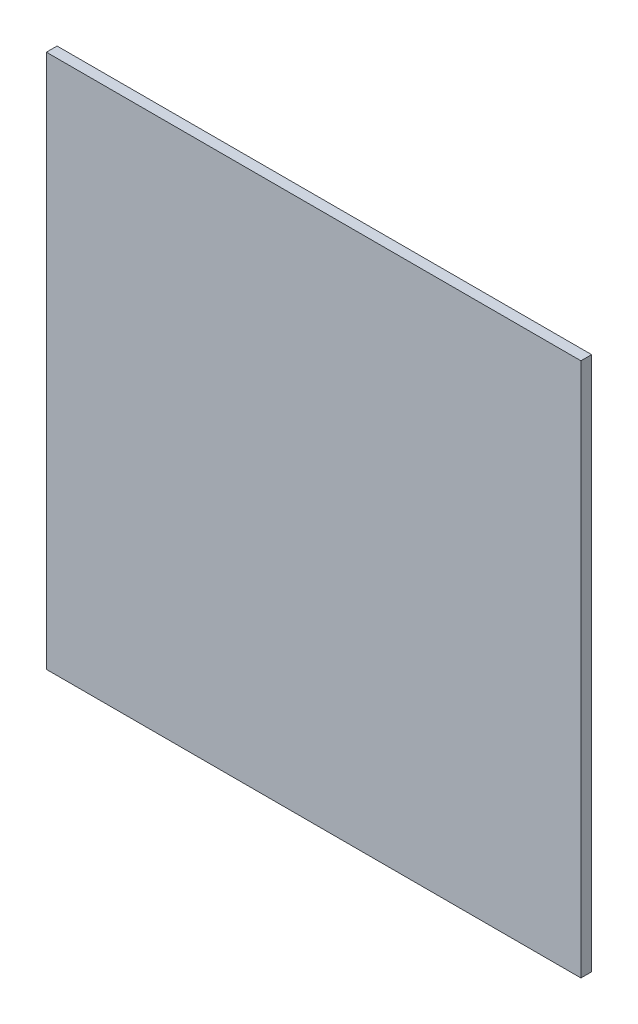
ISO-10303-21;
HEADER;
FILE_DESCRIPTION(('STEP AP214'),'2;1');
FILE_NAME('part.step','',(''),(''),'','','');
FILE_SCHEMA(('AUTOMOTIVE_DESIGN { 1 0 10303 214 1 1 1 1 }'));
ENDSEC;
DATA;
#1=APPLICATION_CONTEXT('core data for automotive mechanical design processes');
#2=APPLICATION_PROTOCOL_DEFINITION('international standard','automotive_design',2000,#1);
#3=PRODUCT_CONTEXT('',#1,'mechanical');
#4=PRODUCT('Part','Part','',(#3));
#5=PRODUCT_RELATED_PRODUCT_CATEGORY('part','',(#4));
#6=PRODUCT_DEFINITION_FORMATION('','',#4);
#7=PRODUCT_DEFINITION_CONTEXT('part definition',#1,'design');
#8=PRODUCT_DEFINITION('design','',#6,#7);
#9=PRODUCT_DEFINITION_SHAPE('','',#8);
#10=(LENGTH_UNIT() NAMED_UNIT(*) SI_UNIT(.MILLI.,.METRE.));
#11=(NAMED_UNIT(*) PLANE_ANGLE_UNIT() SI_UNIT($,.RADIAN.));
#12=(NAMED_UNIT(*) SI_UNIT($,.STERADIAN.) SOLID_ANGLE_UNIT());
#13=UNCERTAINTY_MEASURE_WITH_UNIT(LENGTH_MEASURE(1.E-05),#10,'distance_accuracy_value','');
#14=(GEOMETRIC_REPRESENTATION_CONTEXT(3) GLOBAL_UNCERTAINTY_ASSIGNED_CONTEXT((#13)) GLOBAL_UNIT_ASSIGNED_CONTEXT((#10,
#11,#12)) REPRESENTATION_CONTEXT('',''));
#15=CARTESIAN_POINT('',(0.,0.,0.));
#16=DIRECTION('',(0.,0.,1.));
#17=DIRECTION('',(1.,0.,0.));
#18=AXIS2_PLACEMENT_3D('',#15,#16,#17);
#19=CARTESIAN_POINT('',(250.,250.,10.));
#20=DIRECTION('',(-1.,0.,0.));
#21=DIRECTION('',(0.,-1.,0.));
#22=AXIS2_PLACEMENT_3D('',#19,#20,#21);
#23=PLANE('',#22);
#24=DIRECTION('',(0.,1.,0.));
#25=VECTOR('',#24,1.);
#26=CARTESIAN_POINT('',(250.,250.,0.));
#27=LINE('',#26,#25);
#28=CARTESIAN_POINT('',(250.,-250.,0.));
#29=VERTEX_POINT('',#28);
#30=CARTESIAN_POINT('',(250.,250.,0.));
#31=VERTEX_POINT('',#30);
#32=EDGE_CURVE('E96',#29,#31,#27,.T.);
#33=ORIENTED_EDGE('',*,*,#32,.T.);
#34=DIRECTION('',(0.,0.,-1.));
#35=VECTOR('',#34,1.);
#36=CARTESIAN_POINT('',(250.,250.,10.));
#37=LINE('',#36,#35);
#38=CARTESIAN_POINT('',(250.,250.,10.));
#39=VERTEX_POINT('',#38);
#40=EDGE_CURVE('E11',#39,#31,#37,.T.);
#41=ORIENTED_EDGE('',*,*,#40,.F.);
#42=DIRECTION('',(0.,1.,0.));
#43=VECTOR('',#42,1.);
#44=CARTESIAN_POINT('',(250.,250.,10.));
#45=LINE('',#44,#43);
#46=CARTESIAN_POINT('',(250.,-250.,10.));
#47=VERTEX_POINT('',#46);
#48=EDGE_CURVE('E84',#47,#39,#45,.T.);
#49=ORIENTED_EDGE('',*,*,#48,.F.);
#50=DIRECTION('',(0.,0.,-1.));
#51=VECTOR('',#50,1.);
#52=CARTESIAN_POINT('',(250.,-250.,10.));
#53=LINE('',#52,#51);
#54=EDGE_CURVE('E92',#47,#29,#53,.T.);
#55=ORIENTED_EDGE('',*,*,#54,.T.);
#56=EDGE_LOOP('',(#33,#41,#49,#55));
#57=FACE_BOUND('',#56,.T.);
#58=ADVANCED_FACE('F33',(#57),#23,.F.);
#59=CARTESIAN_POINT('',(-250.,250.,10.));
#60=DIRECTION('',(0.,-1.,0.));
#61=DIRECTION('',(0.,0.,-1.));
#62=AXIS2_PLACEMENT_3D('',#59,#60,#61);
#63=PLANE('',#62);
#64=DIRECTION('',(-1.,0.,0.));
#65=VECTOR('',#64,1.);
#66=CARTESIAN_POINT('',(-250.,250.,0.));
#67=LINE('',#66,#65);
#68=CARTESIAN_POINT('',(-250.,250.,0.));
#69=VERTEX_POINT('',#68);
#70=EDGE_CURVE('E88',#31,#69,#67,.T.);
#71=ORIENTED_EDGE('',*,*,#70,.T.);
#72=DIRECTION('',(0.,0.,-1.));
#73=VECTOR('',#72,1.);
#74=CARTESIAN_POINT('',(-250.,250.,10.));
#75=LINE('',#74,#73);
#76=CARTESIAN_POINT('',(-250.,250.,10.));
#77=VERTEX_POINT('',#76);
#78=EDGE_CURVE('E41',#77,#69,#75,.T.);
#79=ORIENTED_EDGE('',*,*,#78,.F.);
#80=DIRECTION('',(-1.,0.,0.));
#81=VECTOR('',#80,1.);
#82=CARTESIAN_POINT('',(-250.,250.,10.));
#83=LINE('',#82,#81);
#84=EDGE_CURVE('E79',#39,#77,#83,.T.);
#85=ORIENTED_EDGE('',*,*,#84,.F.);
#86=ORIENTED_EDGE('',*,*,#40,.T.);
#87=EDGE_LOOP('',(#71,#79,#85,#86));
#88=FACE_BOUND('',#87,.T.);
#89=ADVANCED_FACE('F87',(#88),#63,.F.);
#90=CARTESIAN_POINT('',(-250.,250.,10.));
#91=DIRECTION('',(1.,0.,0.));
#92=DIRECTION('',(0.,1.,0.));
#93=AXIS2_PLACEMENT_3D('',#90,#91,#92);
#94=PLANE('',#93);
#95=DIRECTION('',(0.,-1.,0.));
#96=VECTOR('',#95,1.);
#97=CARTESIAN_POINT('',(-250.,250.,0.));
#98=LINE('',#97,#96);
#99=CARTESIAN_POINT('',(-250.,-250.,0.));
#100=VERTEX_POINT('',#99);
#101=EDGE_CURVE('E66',#69,#100,#98,.T.);
#102=ORIENTED_EDGE('',*,*,#101,.T.);
#103=DIRECTION('',(0.,0.,-1.));
#104=VECTOR('',#103,1.);
#105=CARTESIAN_POINT('',(-250.,-250.,10.));
#106=LINE('',#105,#104);
#107=CARTESIAN_POINT('',(-250.,-250.,10.));
#108=VERTEX_POINT('',#107);
#109=EDGE_CURVE('E89',#108,#100,#106,.T.);
#110=ORIENTED_EDGE('',*,*,#109,.F.);
#111=DIRECTION('',(0.,-1.,0.));
#112=VECTOR('',#111,1.);
#113=CARTESIAN_POINT('',(-250.,250.,10.));
#114=LINE('',#113,#112);
#115=EDGE_CURVE('E82',#77,#108,#114,.T.);
#116=ORIENTED_EDGE('',*,*,#115,.F.);
#117=ORIENTED_EDGE('',*,*,#78,.T.);
#118=EDGE_LOOP('',(#102,#110,#116,#117));
#119=FACE_BOUND('',#118,.T.);
#120=ADVANCED_FACE('F90',(#119),#94,.F.);
#121=CARTESIAN_POINT('',(-250.,-250.,10.));
#122=DIRECTION('',(0.,1.,0.));
#123=DIRECTION('',(0.,0.,1.));
#124=AXIS2_PLACEMENT_3D('',#121,#122,#123);
#125=PLANE('',#124);
#126=DIRECTION('',(1.,0.,0.));
#127=VECTOR('',#126,1.);
#128=CARTESIAN_POINT('',(-250.,-250.,0.));
#129=LINE('',#128,#127);
#130=EDGE_CURVE('E72',#100,#29,#129,.T.);
#131=ORIENTED_EDGE('',*,*,#130,.T.);
#132=ORIENTED_EDGE('',*,*,#54,.F.);
#133=DIRECTION('',(1.,0.,0.));
#134=VECTOR('',#133,1.);
#135=CARTESIAN_POINT('',(-250.,-250.,10.));
#136=LINE('',#135,#134);
#137=EDGE_CURVE('E49',#108,#47,#136,.T.);
#138=ORIENTED_EDGE('',*,*,#137,.F.);
#139=ORIENTED_EDGE('',*,*,#109,.T.);
#140=EDGE_LOOP('',(#131,#132,#138,#139));
#141=FACE_BOUND('',#140,.T.);
#142=ADVANCED_FACE('F103',(#141),#125,.F.);
#143=CARTESIAN_POINT('',(0.,0.,10.));
#144=DIRECTION('',(0.,0.,1.));
#145=DIRECTION('',(1.,0.,0.));
#146=AXIS2_PLACEMENT_3D('',#143,#144,#145);
#147=PLANE('',#146);
#148=ORIENTED_EDGE('',*,*,#48,.T.);
#149=ORIENTED_EDGE('',*,*,#84,.T.);
#150=ORIENTED_EDGE('',*,*,#115,.T.);
#151=ORIENTED_EDGE('',*,*,#137,.T.);
#152=EDGE_LOOP('',(#148,#149,#150,#151));
#153=FACE_BOUND('',#152,.T.);
#154=ADVANCED_FACE('F80',(#153),#147,.T.);
#155=CARTESIAN_POINT('',(0.,0.,0.));
#156=DIRECTION('',(0.,0.,1.));
#157=DIRECTION('',(1.,0.,0.));
#158=AXIS2_PLACEMENT_3D('',#155,#156,#157);
#159=PLANE('',#158);
#160=ORIENTED_EDGE('',*,*,#32,.F.);
#161=ORIENTED_EDGE('',*,*,#130,.F.);
#162=ORIENTED_EDGE('',*,*,#101,.F.);
#163=ORIENTED_EDGE('',*,*,#70,.F.);
#164=EDGE_LOOP('',(#160,#161,#162,#163));
#165=FACE_BOUND('',#164,.T.);
#166=ADVANCED_FACE('F106',(#165),#159,.F.);
#167=CLOSED_SHELL('',(#58,#89,#120,#142,#154,#166));
#168=MANIFOLD_SOLID_BREP('B2',#167);
#169=ADVANCED_BREP_SHAPE_REPRESENTATION('',(#18,#168),#14);
#170=SHAPE_DEFINITION_REPRESENTATION(#9,#169);
ENDSEC;
END-ISO-10303-21;
